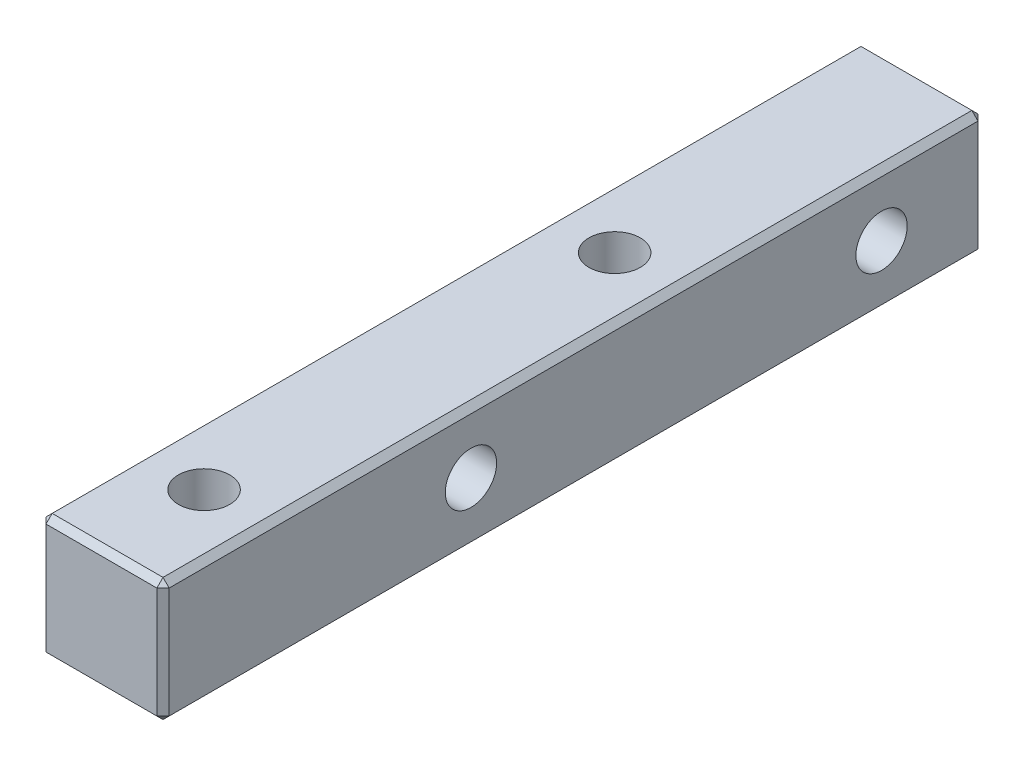
ISO-10303-21;
HEADER;
FILE_DESCRIPTION(('STEP AP214'),'2;1');
FILE_NAME('part.step','',(''),(''),'','','');
FILE_SCHEMA(('AUTOMOTIVE_DESIGN { 1 0 10303 214 1 1 1 1 }'));
ENDSEC;
DATA;
#1=APPLICATION_CONTEXT('core data for automotive mechanical design processes');
#2=APPLICATION_PROTOCOL_DEFINITION('international standard','automotive_design',2000,#1);
#3=PRODUCT_CONTEXT('',#1,'mechanical');
#4=PRODUCT('Part','Part','',(#3));
#5=PRODUCT_RELATED_PRODUCT_CATEGORY('part','',(#4));
#6=PRODUCT_DEFINITION_FORMATION('','',#4);
#7=PRODUCT_DEFINITION_CONTEXT('part definition',#1,'design');
#8=PRODUCT_DEFINITION('design','',#6,#7);
#9=PRODUCT_DEFINITION_SHAPE('','',#8);
#10=(LENGTH_UNIT() NAMED_UNIT(*) SI_UNIT(.MILLI.,.METRE.));
#11=(NAMED_UNIT(*) PLANE_ANGLE_UNIT() SI_UNIT($,.RADIAN.));
#12=(NAMED_UNIT(*) SI_UNIT($,.STERADIAN.) SOLID_ANGLE_UNIT());
#13=UNCERTAINTY_MEASURE_WITH_UNIT(LENGTH_MEASURE(1.E-05),#10,'distance_accuracy_value','');
#14=(GEOMETRIC_REPRESENTATION_CONTEXT(3) GLOBAL_UNCERTAINTY_ASSIGNED_CONTEXT((#13)) GLOBAL_UNIT_ASSIGNED_CONTEXT((#10,
#11,#12)) REPRESENTATION_CONTEXT('',''));
#15=CARTESIAN_POINT('',(0.,0.,0.));
#16=DIRECTION('',(0.,0.,1.));
#17=DIRECTION('',(1.,0.,0.));
#18=AXIS2_PLACEMENT_3D('',#15,#16,#17);
#19=CARTESIAN_POINT('',(-3.,-3.,20.));
#20=DIRECTION('',(1.,0.,0.));
#21=DIRECTION('',(0.,0.,-1.));
#22=AXIS2_PLACEMENT_3D('',#19,#20,#21);
#23=PLANE('',#22);
#24=DIRECTION('',(0.,-1.,0.));
#25=VECTOR('',#24,1.);
#26=CARTESIAN_POINT('',(-3.,-3.,-19.7));
#27=LINE('',#26,#25);
#28=CARTESIAN_POINT('',(-3.,2.7,-19.7));
#29=VERTEX_POINT('',#28);
#30=CARTESIAN_POINT('',(-3.,-2.7,-19.7));
#31=VERTEX_POINT('',#30);
#32=EDGE_CURVE('E192',#29,#31,#27,.T.);
#33=ORIENTED_EDGE('',*,*,#32,.T.);
#34=DIRECTION('',(0.,0.,1.));
#35=VECTOR('',#34,1.);
#36=CARTESIAN_POINT('',(-3.,-2.7,20.));
#37=LINE('',#36,#35);
#38=CARTESIAN_POINT('',(-3.,-2.7,19.7));
#39=VERTEX_POINT('',#38);
#40=EDGE_CURVE('E194',#31,#39,#37,.T.);
#41=ORIENTED_EDGE('',*,*,#40,.T.);
#42=DIRECTION('',(0.,1.,0.));
#43=VECTOR('',#42,1.);
#44=CARTESIAN_POINT('',(-3.,-3.,19.7));
#45=LINE('',#44,#43);
#46=CARTESIAN_POINT('',(-3.,2.7,19.7));
#47=VERTEX_POINT('',#46);
#48=EDGE_CURVE('E190',#39,#47,#45,.T.);
#49=ORIENTED_EDGE('',*,*,#48,.T.);
#50=DIRECTION('',(0.,0.,-1.));
#51=VECTOR('',#50,1.);
#52=CARTESIAN_POINT('',(-3.,2.7,20.));
#53=LINE('',#52,#51);
#54=EDGE_CURVE('E188',#47,#29,#53,.T.);
#55=ORIENTED_EDGE('',*,*,#54,.T.);
#56=EDGE_LOOP('',(#33,#41,#49,#55));
#57=FACE_BOUND('',#56,.T.);
#58=CARTESIAN_POINT('',(-3.,0.,-15.));
#59=DIRECTION('',(-1.,0.,0.));
#60=DIRECTION('',(0.,0.,1.));
#61=AXIS2_PLACEMENT_3D('',#58,#59,#60);
#62=CIRCLE('',#61,1.24999999999999);
#63=CARTESIAN_POINT('',(-3.,0.,-13.75));
#64=VERTEX_POINT('',#63);
#65=EDGE_CURVE('E285',#64,#64,#62,.T.);
#66=ORIENTED_EDGE('',*,*,#65,.F.);
#67=EDGE_LOOP('',(#66));
#68=FACE_BOUND('',#67,.T.);
#69=CARTESIAN_POINT('',(-3.,0.,5.));
#70=DIRECTION('',(-1.,0.,0.));
#71=DIRECTION('',(0.,0.,1.));
#72=AXIS2_PLACEMENT_3D('',#69,#70,#71);
#73=CIRCLE('',#72,1.24999999999999);
#74=CARTESIAN_POINT('',(-3.,0.,6.24999999999999));
#75=VERTEX_POINT('',#74);
#76=EDGE_CURVE('E291',#75,#75,#73,.T.);
#77=ORIENTED_EDGE('',*,*,#76,.F.);
#78=EDGE_LOOP('',(#77));
#79=FACE_BOUND('',#78,.T.);
#80=ADVANCED_FACE('F42',(#57,#68,#79),#23,.F.);
#81=CARTESIAN_POINT('',(3.,-3.,20.));
#82=DIRECTION('',(-1.,0.,0.));
#83=DIRECTION('',(0.,-1.,0.));
#84=AXIS2_PLACEMENT_3D('',#81,#82,#83);
#85=PLANE('',#84);
#86=DIRECTION('',(0.,0.,1.));
#87=VECTOR('',#86,1.);
#88=CARTESIAN_POINT('',(3.,2.7,20.));
#89=LINE('',#88,#87);
#90=CARTESIAN_POINT('',(3.,2.7,-19.7));
#91=VERTEX_POINT('',#90);
#92=CARTESIAN_POINT('',(3.,2.7,19.7));
#93=VERTEX_POINT('',#92);
#94=EDGE_CURVE('E206',#91,#93,#89,.T.);
#95=ORIENTED_EDGE('',*,*,#94,.T.);
#96=DIRECTION('',(0.,-1.,0.));
#97=VECTOR('',#96,1.);
#98=CARTESIAN_POINT('',(3.,-3.,19.7));
#99=LINE('',#98,#97);
#100=CARTESIAN_POINT('',(3.,-2.7,19.7));
#101=VERTEX_POINT('',#100);
#102=EDGE_CURVE('E11',#93,#101,#99,.T.);
#103=ORIENTED_EDGE('',*,*,#102,.T.);
#104=DIRECTION('',(0.,0.,-1.));
#105=VECTOR('',#104,1.);
#106=CARTESIAN_POINT('',(3.,-2.7,20.));
#107=LINE('',#106,#105);
#108=CARTESIAN_POINT('',(3.,-2.7,-19.7));
#109=VERTEX_POINT('',#108);
#110=EDGE_CURVE('E52',#101,#109,#107,.T.);
#111=ORIENTED_EDGE('',*,*,#110,.T.);
#112=DIRECTION('',(0.,1.,0.));
#113=VECTOR('',#112,1.);
#114=CARTESIAN_POINT('',(3.,3.,-19.7));
#115=LINE('',#114,#113);
#116=EDGE_CURVE('E208',#109,#91,#115,.T.);
#117=ORIENTED_EDGE('',*,*,#116,.T.);
#118=EDGE_LOOP('',(#95,#103,#111,#117));
#119=FACE_BOUND('',#118,.T.);
#120=CARTESIAN_POINT('',(3.,0.,-15.));
#121=DIRECTION('',(-1.,0.,0.));
#122=DIRECTION('',(0.,-1.,0.));
#123=AXIS2_PLACEMENT_3D('',#120,#121,#122);
#124=CIRCLE('',#123,1.24999999999999);
#125=CARTESIAN_POINT('',(3.,-1.24999999999999,-15.));
#126=VERTEX_POINT('',#125);
#127=EDGE_CURVE('E288',#126,#126,#124,.T.);
#128=ORIENTED_EDGE('',*,*,#127,.T.);
#129=EDGE_LOOP('',(#128));
#130=FACE_BOUND('',#129,.T.);
#131=CARTESIAN_POINT('',(3.,0.,5.));
#132=DIRECTION('',(-1.,0.,0.));
#133=DIRECTION('',(0.,-1.,0.));
#134=AXIS2_PLACEMENT_3D('',#131,#132,#133);
#135=CIRCLE('',#134,1.24999999999999);
#136=CARTESIAN_POINT('',(3.,-1.24999999999999,5.));
#137=VERTEX_POINT('',#136);
#138=EDGE_CURVE('E161',#137,#137,#135,.T.);
#139=ORIENTED_EDGE('',*,*,#138,.T.);
#140=EDGE_LOOP('',(#139));
#141=FACE_BOUND('',#140,.T.);
#142=ADVANCED_FACE('F363',(#119,#130,#141),#85,.F.);
#143=CARTESIAN_POINT('',(-3.,3.,20.));
#144=DIRECTION('',(0.,-1.,0.));
#145=DIRECTION('',(1.,0.,0.));
#146=AXIS2_PLACEMENT_3D('',#143,#144,#145);
#147=PLANE('',#146);
#148=DIRECTION('',(0.,0.,-1.));
#149=VECTOR('',#148,1.);
#150=CARTESIAN_POINT('',(2.7,3.,20.));
#151=LINE('',#150,#149);
#152=CARTESIAN_POINT('',(2.7,3.,19.7));
#153=VERTEX_POINT('',#152);
#154=CARTESIAN_POINT('',(2.7,3.,-19.7));
#155=VERTEX_POINT('',#154);
#156=EDGE_CURVE('E166',#153,#155,#151,.T.);
#157=ORIENTED_EDGE('',*,*,#156,.T.);
#158=DIRECTION('',(-1.,0.,0.));
#159=VECTOR('',#158,1.);
#160=CARTESIAN_POINT('',(-3.,3.,-19.7));
#161=LINE('',#160,#159);
#162=CARTESIAN_POINT('',(-2.7,3.,-19.7));
#163=VERTEX_POINT('',#162);
#164=EDGE_CURVE('E136',#155,#163,#161,.T.);
#165=ORIENTED_EDGE('',*,*,#164,.T.);
#166=DIRECTION('',(0.,0.,1.));
#167=VECTOR('',#166,1.);
#168=CARTESIAN_POINT('',(-2.7,3.,20.));
#169=LINE('',#168,#167);
#170=CARTESIAN_POINT('',(-2.7,3.,19.7));
#171=VERTEX_POINT('',#170);
#172=EDGE_CURVE('E154',#163,#171,#169,.T.);
#173=ORIENTED_EDGE('',*,*,#172,.T.);
#174=DIRECTION('',(1.,0.,0.));
#175=VECTOR('',#174,1.);
#176=CARTESIAN_POINT('',(-3.,3.,19.7));
#177=LINE('',#176,#175);
#178=EDGE_CURVE('E160',#171,#153,#177,.T.);
#179=ORIENTED_EDGE('',*,*,#178,.T.);
#180=EDGE_LOOP('',(#157,#165,#173,#179));
#181=FACE_BOUND('',#180,.T.);
#182=CARTESIAN_POINT('',(0.,3.,-5.));
#183=DIRECTION('',(0.,1.,0.));
#184=DIRECTION('',(0.,0.,1.));
#185=AXIS2_PLACEMENT_3D('',#182,#183,#184);
#186=CIRCLE('',#185,1.24999999999999);
#187=CARTESIAN_POINT('',(0.,3.,-3.75000000000001));
#188=VERTEX_POINT('',#187);
#189=EDGE_CURVE('E267',#188,#188,#186,.T.);
#190=ORIENTED_EDGE('',*,*,#189,.F.);
#191=EDGE_LOOP('',(#190));
#192=FACE_BOUND('',#191,.T.);
#193=CARTESIAN_POINT('',(0.,3.,15.));
#194=DIRECTION('',(0.,1.,0.));
#195=DIRECTION('',(0.,0.,1.));
#196=AXIS2_PLACEMENT_3D('',#193,#194,#195);
#197=CIRCLE('',#196,1.24999999999999);
#198=CARTESIAN_POINT('',(0.,3.,16.25));
#199=VERTEX_POINT('',#198);
#200=EDGE_CURVE('E277',#199,#199,#197,.T.);
#201=ORIENTED_EDGE('',*,*,#200,.F.);
#202=EDGE_LOOP('',(#201));
#203=FACE_BOUND('',#202,.T.);
#204=ADVANCED_FACE('F163',(#181,#192,#203),#147,.F.);
#205=CARTESIAN_POINT('',(-3.,-3.,20.));
#206=DIRECTION('',(0.,1.,0.));
#207=DIRECTION('',(0.,0.,1.));
#208=AXIS2_PLACEMENT_3D('',#205,#206,#207);
#209=PLANE('',#208);
#210=DIRECTION('',(0.,0.,1.));
#211=VECTOR('',#210,1.);
#212=CARTESIAN_POINT('',(2.7,-3.,20.));
#213=LINE('',#212,#211);
#214=CARTESIAN_POINT('',(2.7,-3.,-19.7));
#215=VERTEX_POINT('',#214);
#216=CARTESIAN_POINT('',(2.7,-3.,19.7));
#217=VERTEX_POINT('',#216);
#218=EDGE_CURVE('E181',#215,#217,#213,.T.);
#219=ORIENTED_EDGE('',*,*,#218,.T.);
#220=DIRECTION('',(-1.,0.,0.));
#221=VECTOR('',#220,1.);
#222=CARTESIAN_POINT('',(-3.,-3.,19.7));
#223=LINE('',#222,#221);
#224=CARTESIAN_POINT('',(-2.7,-3.,19.7));
#225=VERTEX_POINT('',#224);
#226=EDGE_CURVE('E186',#217,#225,#223,.T.);
#227=ORIENTED_EDGE('',*,*,#226,.T.);
#228=DIRECTION('',(0.,0.,-1.));
#229=VECTOR('',#228,1.);
#230=CARTESIAN_POINT('',(-2.7,-3.,20.));
#231=LINE('',#230,#229);
#232=CARTESIAN_POINT('',(-2.7,-3.,-19.7));
#233=VERTEX_POINT('',#232);
#234=EDGE_CURVE('E183',#225,#233,#231,.T.);
#235=ORIENTED_EDGE('',*,*,#234,.T.);
#236=DIRECTION('',(1.,0.,0.));
#237=VECTOR('',#236,1.);
#238=CARTESIAN_POINT('',(3.,-3.,-19.7));
#239=LINE('',#238,#237);
#240=EDGE_CURVE('E179',#233,#215,#239,.T.);
#241=ORIENTED_EDGE('',*,*,#240,.T.);
#242=EDGE_LOOP('',(#219,#227,#235,#241));
#243=FACE_BOUND('',#242,.T.);
#244=CARTESIAN_POINT('',(0.,-3.,-5.));
#245=DIRECTION('',(0.,1.,0.));
#246=DIRECTION('',(0.,0.,1.));
#247=AXIS2_PLACEMENT_3D('',#244,#245,#246);
#248=CIRCLE('',#247,1.24999999999999);
#249=CARTESIAN_POINT('',(0.,-3.,-3.75000000000001));
#250=VERTEX_POINT('',#249);
#251=EDGE_CURVE('E272',#250,#250,#248,.T.);
#252=ORIENTED_EDGE('',*,*,#251,.T.);
#253=EDGE_LOOP('',(#252));
#254=FACE_BOUND('',#253,.T.);
#255=CARTESIAN_POINT('',(0.,-3.,15.));
#256=DIRECTION('',(0.,1.,0.));
#257=DIRECTION('',(0.,0.,1.));
#258=AXIS2_PLACEMENT_3D('',#255,#256,#257);
#259=CIRCLE('',#258,1.24999999999999);
#260=CARTESIAN_POINT('',(0.,-3.,16.25));
#261=VERTEX_POINT('',#260);
#262=EDGE_CURVE('E282',#261,#261,#259,.T.);
#263=ORIENTED_EDGE('',*,*,#262,.T.);
#264=EDGE_LOOP('',(#263));
#265=FACE_BOUND('',#264,.T.);
#266=ADVANCED_FACE('F340',(#243,#254,#265),#209,.F.);
#267=CARTESIAN_POINT('',(0.,0.,20.));
#268=DIRECTION('',(0.,0.,-1.));
#269=DIRECTION('',(-1.,0.,0.));
#270=AXIS2_PLACEMENT_3D('',#267,#268,#269);
#271=PLANE('',#270);
#272=DIRECTION('',(1.,0.,0.));
#273=VECTOR('',#272,1.);
#274=CARTESIAN_POINT('',(0.,-2.7,20.));
#275=LINE('',#274,#273);
#276=CARTESIAN_POINT('',(-2.7,-2.7,20.));
#277=VERTEX_POINT('',#276);
#278=CARTESIAN_POINT('',(2.7,-2.7,20.));
#279=VERTEX_POINT('',#278);
#280=EDGE_CURVE('E201',#277,#279,#275,.T.);
#281=ORIENTED_EDGE('',*,*,#280,.T.);
#282=DIRECTION('',(0.,1.,0.));
#283=VECTOR('',#282,1.);
#284=CARTESIAN_POINT('',(2.7,0.,20.));
#285=LINE('',#284,#283);
#286=CARTESIAN_POINT('',(2.7,2.7,20.));
#287=VERTEX_POINT('',#286);
#288=EDGE_CURVE('E203',#279,#287,#285,.T.);
#289=ORIENTED_EDGE('',*,*,#288,.T.);
#290=DIRECTION('',(-1.,0.,0.));
#291=VECTOR('',#290,1.);
#292=CARTESIAN_POINT('',(0.,2.7,20.));
#293=LINE('',#292,#291);
#294=CARTESIAN_POINT('',(-2.7,2.7,20.));
#295=VERTEX_POINT('',#294);
#296=EDGE_CURVE('E199',#287,#295,#293,.T.);
#297=ORIENTED_EDGE('',*,*,#296,.T.);
#298=DIRECTION('',(0.,-1.,0.));
#299=VECTOR('',#298,1.);
#300=CARTESIAN_POINT('',(-2.7,0.,20.));
#301=LINE('',#300,#299);
#302=EDGE_CURVE('E197',#295,#277,#301,.T.);
#303=ORIENTED_EDGE('',*,*,#302,.T.);
#304=EDGE_LOOP('',(#281,#289,#297,#303));
#305=FACE_BOUND('',#304,.T.);
#306=ADVANCED_FACE('F466',(#305),#271,.F.);
#307=CARTESIAN_POINT('',(0.,0.,-20.));
#308=DIRECTION('',(0.,0.,-1.));
#309=DIRECTION('',(-1.,0.,0.));
#310=AXIS2_PLACEMENT_3D('',#307,#308,#309);
#311=PLANE('',#310);
#312=DIRECTION('',(-1.,0.,0.));
#313=VECTOR('',#312,1.);
#314=CARTESIAN_POINT('',(-3.,-2.7,-20.));
#315=LINE('',#314,#313);
#316=CARTESIAN_POINT('',(2.7,-2.7,-20.));
#317=VERTEX_POINT('',#316);
#318=CARTESIAN_POINT('',(-2.7,-2.7,-20.));
#319=VERTEX_POINT('',#318);
#320=EDGE_CURVE('E170',#317,#319,#315,.T.);
#321=ORIENTED_EDGE('',*,*,#320,.T.);
#322=DIRECTION('',(0.,1.,0.));
#323=VECTOR('',#322,1.);
#324=CARTESIAN_POINT('',(-2.7,3.,-20.));
#325=LINE('',#324,#323);
#326=CARTESIAN_POINT('',(-2.7,2.7,-20.));
#327=VERTEX_POINT('',#326);
#328=EDGE_CURVE('E177',#319,#327,#325,.T.);
#329=ORIENTED_EDGE('',*,*,#328,.T.);
#330=DIRECTION('',(1.,0.,0.));
#331=VECTOR('',#330,1.);
#332=CARTESIAN_POINT('',(3.,2.7,-20.));
#333=LINE('',#332,#331);
#334=CARTESIAN_POINT('',(2.7,2.7,-20.));
#335=VERTEX_POINT('',#334);
#336=EDGE_CURVE('E138',#327,#335,#333,.T.);
#337=ORIENTED_EDGE('',*,*,#336,.T.);
#338=DIRECTION('',(0.,-1.,0.));
#339=VECTOR('',#338,1.);
#340=CARTESIAN_POINT('',(2.7,-3.,-20.));
#341=LINE('',#340,#339);
#342=EDGE_CURVE('E168',#335,#317,#341,.T.);
#343=ORIENTED_EDGE('',*,*,#342,.T.);
#344=EDGE_LOOP('',(#321,#329,#337,#343));
#345=FACE_BOUND('',#344,.T.);
#346=ADVANCED_FACE('F318',(#345),#311,.T.);
#347=CARTESIAN_POINT('',(-3.,0.,5.));
#348=DIRECTION('',(-1.,0.,0.));
#349=DIRECTION('',(0.,0.,1.));
#350=AXIS2_PLACEMENT_3D('',#347,#348,#349);
#351=CYLINDRICAL_SURFACE('',#350,1.24999999999999);
#352=ORIENTED_EDGE('',*,*,#138,.F.);
#353=EDGE_LOOP('',(#352));
#354=FACE_BOUND('',#353,.T.);
#355=ORIENTED_EDGE('',*,*,#76,.T.);
#356=EDGE_LOOP('',(#355));
#357=FACE_BOUND('',#356,.T.);
#358=ADVANCED_FACE('F473',(#354,#357),#351,.F.);
#359=CARTESIAN_POINT('',(-3.,0.,-15.));
#360=DIRECTION('',(-1.,0.,0.));
#361=DIRECTION('',(0.,0.,1.));
#362=AXIS2_PLACEMENT_3D('',#359,#360,#361);
#363=CYLINDRICAL_SURFACE('',#362,1.24999999999999);
#364=ORIENTED_EDGE('',*,*,#127,.F.);
#365=EDGE_LOOP('',(#364));
#366=FACE_BOUND('',#365,.T.);
#367=ORIENTED_EDGE('',*,*,#65,.T.);
#368=EDGE_LOOP('',(#367));
#369=FACE_BOUND('',#368,.T.);
#370=ADVANCED_FACE('F477',(#366,#369),#363,.F.);
#371=CARTESIAN_POINT('',(0.,3.,15.));
#372=DIRECTION('',(0.,1.,0.));
#373=DIRECTION('',(0.,0.,1.));
#374=AXIS2_PLACEMENT_3D('',#371,#372,#373);
#375=CYLINDRICAL_SURFACE('',#374,1.24999999999999);
#376=ORIENTED_EDGE('',*,*,#262,.F.);
#377=EDGE_LOOP('',(#376));
#378=FACE_BOUND('',#377,.T.);
#379=ORIENTED_EDGE('',*,*,#200,.T.);
#380=EDGE_LOOP('',(#379));
#381=FACE_BOUND('',#380,.T.);
#382=ADVANCED_FACE('F481',(#378,#381),#375,.F.);
#383=CARTESIAN_POINT('',(0.,3.,-5.));
#384=DIRECTION('',(0.,1.,0.));
#385=DIRECTION('',(0.,0.,1.));
#386=AXIS2_PLACEMENT_3D('',#383,#384,#385);
#387=CYLINDRICAL_SURFACE('',#386,1.24999999999999);
#388=ORIENTED_EDGE('',*,*,#251,.F.);
#389=EDGE_LOOP('',(#388));
#390=FACE_BOUND('',#389,.T.);
#391=ORIENTED_EDGE('',*,*,#189,.T.);
#392=EDGE_LOOP('',(#391));
#393=FACE_BOUND('',#392,.T.);
#394=ADVANCED_FACE('F461',(#390,#393),#387,.F.);
#395=CARTESIAN_POINT('',(0.,-2.7,20.));
#396=DIRECTION('',(0.,0.707106781186547,-0.707106781186547));
#397=DIRECTION('',(1.,0.,0.));
#398=AXIS2_PLACEMENT_3D('',#395,#396,#397);
#399=PLANE('',#398);
#400=DIRECTION('',(0.,0.707106781186547,0.707106781186547));
#401=VECTOR('',#400,1.);
#402=CARTESIAN_POINT('',(2.7,-2.85,19.85));
#403=LINE('',#402,#401);
#404=EDGE_CURVE('E47',#279,#217,#403,.F.);
#405=ORIENTED_EDGE('',*,*,#404,.F.);
#406=ORIENTED_EDGE('',*,*,#280,.F.);
#407=DIRECTION('',(0.,-0.707106781186547,-0.707106781186547));
#408=VECTOR('',#407,1.);
#409=CARTESIAN_POINT('',(-2.7,-2.85,19.85));
#410=LINE('',#409,#408);
#411=EDGE_CURVE('E260',#225,#277,#410,.F.);
#412=ORIENTED_EDGE('',*,*,#411,.F.);
#413=ORIENTED_EDGE('',*,*,#226,.F.);
#414=EDGE_LOOP('',(#405,#406,#412,#413));
#415=FACE_BOUND('',#414,.T.);
#416=ADVANCED_FACE('F45',(#415),#399,.F.);
#417=CARTESIAN_POINT('',(3.,-2.7,19.7));
#418=DIRECTION('',(0.577350269189626,-0.577350269189626,0.577350269189626));
#419=DIRECTION('',(0.707106781186547,0.,-0.707106781186547));
#420=AXIS2_PLACEMENT_3D('',#417,#418,#419);
#421=PLANE('',#420);
#422=DIRECTION('',(0.707106781186548,0.,-0.707106781186548));
#423=VECTOR('',#422,1.);
#424=CARTESIAN_POINT('',(3.,-2.7,19.7));
#425=LINE('',#424,#423);
#426=EDGE_CURVE('E256',#279,#101,#425,.T.);
#427=ORIENTED_EDGE('',*,*,#426,.F.);
#428=ORIENTED_EDGE('',*,*,#404,.T.);
#429=DIRECTION('',(-0.707106781186547,-0.707106781186547,0.));
#430=VECTOR('',#429,1.);
#431=CARTESIAN_POINT('',(3.,-2.7,19.7));
#432=LINE('',#431,#430);
#433=EDGE_CURVE('E259',#101,#217,#432,.T.);
#434=ORIENTED_EDGE('',*,*,#433,.F.);
#435=EDGE_LOOP('',(#427,#428,#434));
#436=FACE_BOUND('',#435,.T.);
#437=ADVANCED_FACE('F453',(#436),#421,.T.);
#438=CARTESIAN_POINT('',(-3.,-2.7,19.7));
#439=DIRECTION('',(-0.577350269189626,-0.577350269189626,0.577350269189626));
#440=DIRECTION('',(0.707106781186547,0.,0.707106781186547));
#441=AXIS2_PLACEMENT_3D('',#438,#439,#440);
#442=PLANE('',#441);
#443=DIRECTION('',(-0.707106781186547,0.707106781186547,0.));
#444=VECTOR('',#443,1.);
#445=CARTESIAN_POINT('',(-3.,-2.7,19.7));
#446=LINE('',#445,#444);
#447=EDGE_CURVE('E250',#225,#39,#446,.T.);
#448=ORIENTED_EDGE('',*,*,#447,.F.);
#449=ORIENTED_EDGE('',*,*,#411,.T.);
#450=DIRECTION('',(0.707106781186547,0.,0.707106781186547));
#451=VECTOR('',#450,1.);
#452=CARTESIAN_POINT('',(-3.,-2.7,19.7));
#453=LINE('',#452,#451);
#454=EDGE_CURVE('E253',#39,#277,#453,.T.);
#455=ORIENTED_EDGE('',*,*,#454,.F.);
#456=EDGE_LOOP('',(#448,#449,#455));
#457=FACE_BOUND('',#456,.T.);
#458=ADVANCED_FACE('F345',(#457),#442,.T.);
#459=CARTESIAN_POINT('',(3.,-2.7,20.));
#460=DIRECTION('',(-0.707106781186547,0.707106781186547,0.));
#461=DIRECTION('',(0.,0.,-1.));
#462=AXIS2_PLACEMENT_3D('',#459,#460,#461);
#463=PLANE('',#462);
#464=ORIENTED_EDGE('',*,*,#433,.T.);
#465=ORIENTED_EDGE('',*,*,#218,.F.);
#466=DIRECTION('',(0.707106781186548,0.707106781186548,0.));
#467=VECTOR('',#466,1.);
#468=CARTESIAN_POINT('',(3.,-2.7,-19.7));
#469=LINE('',#468,#467);
#470=EDGE_CURVE('E244',#109,#215,#469,.F.);
#471=ORIENTED_EDGE('',*,*,#470,.F.);
#472=ORIENTED_EDGE('',*,*,#110,.F.);
#473=EDGE_LOOP('',(#464,#465,#471,#472));
#474=FACE_BOUND('',#473,.T.);
#475=ADVANCED_FACE('F446',(#474),#463,.F.);
#476=CARTESIAN_POINT('',(2.7,0.,20.));
#477=DIRECTION('',(-0.707106781186547,0.,-0.707106781186547));
#478=DIRECTION('',(0.,1.,0.));
#479=AXIS2_PLACEMENT_3D('',#476,#477,#478);
#480=PLANE('',#479);
#481=ORIENTED_EDGE('',*,*,#426,.T.);
#482=ORIENTED_EDGE('',*,*,#102,.F.);
#483=DIRECTION('',(-0.707106781186547,0.,0.707106781186547));
#484=VECTOR('',#483,1.);
#485=CARTESIAN_POINT('',(2.7,2.7,20.));
#486=LINE('',#485,#484);
#487=EDGE_CURVE('E241',#287,#93,#486,.F.);
#488=ORIENTED_EDGE('',*,*,#487,.F.);
#489=ORIENTED_EDGE('',*,*,#288,.F.);
#490=EDGE_LOOP('',(#481,#482,#488,#489));
#491=FACE_BOUND('',#490,.T.);
#492=ADVANCED_FACE('F441',(#491),#480,.F.);
#493=CARTESIAN_POINT('',(0.,2.7,20.));
#494=DIRECTION('',(0.,-0.707106781186547,-0.707106781186547));
#495=DIRECTION('',(-1.,0.,0.));
#496=AXIS2_PLACEMENT_3D('',#493,#494,#495);
#497=PLANE('',#496);
#498=DIRECTION('',(0.,-0.707106781186548,0.707106781186548));
#499=VECTOR('',#498,1.);
#500=CARTESIAN_POINT('',(-2.7,2.7,20.));
#501=LINE('',#500,#499);
#502=EDGE_CURVE('E236',#295,#171,#501,.F.);
#503=ORIENTED_EDGE('',*,*,#502,.F.);
#504=ORIENTED_EDGE('',*,*,#296,.F.);
#505=DIRECTION('',(0.,0.707106781186547,-0.707106781186547));
#506=VECTOR('',#505,1.);
#507=CARTESIAN_POINT('',(2.7,2.7,20.));
#508=LINE('',#507,#506);
#509=EDGE_CURVE('E239',#153,#287,#508,.F.);
#510=ORIENTED_EDGE('',*,*,#509,.F.);
#511=ORIENTED_EDGE('',*,*,#178,.F.);
#512=EDGE_LOOP('',(#503,#504,#510,#511));
#513=FACE_BOUND('',#512,.T.);
#514=ADVANCED_FACE('F300',(#513),#497,.F.);
#515=CARTESIAN_POINT('',(-2.7,0.,20.));
#516=DIRECTION('',(0.707106781186547,0.,-0.707106781186547));
#517=DIRECTION('',(0.,-1.,0.));
#518=AXIS2_PLACEMENT_3D('',#515,#516,#517);
#519=PLANE('',#518);
#520=ORIENTED_EDGE('',*,*,#454,.T.);
#521=ORIENTED_EDGE('',*,*,#302,.F.);
#522=DIRECTION('',(-0.707106781186547,0.,-0.707106781186547));
#523=VECTOR('',#522,1.);
#524=CARTESIAN_POINT('',(-2.7,2.7,20.));
#525=LINE('',#524,#523);
#526=EDGE_CURVE('E233',#47,#295,#525,.F.);
#527=ORIENTED_EDGE('',*,*,#526,.F.);
#528=ORIENTED_EDGE('',*,*,#48,.F.);
#529=EDGE_LOOP('',(#520,#521,#527,#528));
#530=FACE_BOUND('',#529,.T.);
#531=ADVANCED_FACE('F348',(#530),#519,.F.);
#532=CARTESIAN_POINT('',(-2.7,-3.,20.));
#533=DIRECTION('',(0.707106781186547,0.707106781186547,0.));
#534=DIRECTION('',(0.,0.,-1.));
#535=AXIS2_PLACEMENT_3D('',#532,#533,#534);
#536=PLANE('',#535);
#537=ORIENTED_EDGE('',*,*,#447,.T.);
#538=ORIENTED_EDGE('',*,*,#40,.F.);
#539=DIRECTION('',(0.707106781186548,-0.707106781186548,0.));
#540=VECTOR('',#539,1.);
#541=CARTESIAN_POINT('',(-2.7,-3.,-19.7));
#542=LINE('',#541,#540);
#543=EDGE_CURVE('E230',#233,#31,#542,.F.);
#544=ORIENTED_EDGE('',*,*,#543,.F.);
#545=ORIENTED_EDGE('',*,*,#234,.F.);
#546=EDGE_LOOP('',(#537,#538,#544,#545));
#547=FACE_BOUND('',#546,.T.);
#548=ADVANCED_FACE('F330',(#547),#536,.F.);
#549=CARTESIAN_POINT('',(-3.,-3.,-19.7));
#550=DIRECTION('',(0.,-0.707106781186552,-0.707106781186543));
#551=DIRECTION('',(-1.,0.,0.));
#552=AXIS2_PLACEMENT_3D('',#549,#550,#551);
#553=PLANE('',#552);
#554=DIRECTION('',(0.,0.707106781186543,-0.707106781186552));
#555=VECTOR('',#554,1.);
#556=CARTESIAN_POINT('',(2.7,-2.85,-19.85));
#557=LINE('',#556,#555);
#558=EDGE_CURVE('E247',#215,#317,#557,.T.);
#559=ORIENTED_EDGE('',*,*,#558,.F.);
#560=ORIENTED_EDGE('',*,*,#240,.F.);
#561=DIRECTION('',(0.,-0.707106781186543,0.707106781186552));
#562=VECTOR('',#561,1.);
#563=CARTESIAN_POINT('',(-2.7,-3.,-19.7));
#564=LINE('',#563,#562);
#565=EDGE_CURVE('E228',#319,#233,#564,.T.);
#566=ORIENTED_EDGE('',*,*,#565,.F.);
#567=ORIENTED_EDGE('',*,*,#320,.F.);
#568=EDGE_LOOP('',(#559,#560,#566,#567));
#569=FACE_BOUND('',#568,.T.);
#570=ADVANCED_FACE('F337',(#569),#553,.T.);
#571=CARTESIAN_POINT('',(3.,-2.7,-19.7));
#572=DIRECTION('',(0.577350269189628,-0.577350269189628,-0.577350269189621));
#573=DIRECTION('',(0.707106781186547,0.707106781186547,0.));
#574=AXIS2_PLACEMENT_3D('',#571,#572,#573);
#575=PLANE('',#574);
#576=ORIENTED_EDGE('',*,*,#470,.T.);
#577=ORIENTED_EDGE('',*,*,#558,.T.);
#578=DIRECTION('',(0.707106781186543,0.,0.707106781186552));
#579=VECTOR('',#578,1.);
#580=CARTESIAN_POINT('',(3.,-2.7,-19.7));
#581=LINE('',#580,#579);
#582=EDGE_CURVE('E225',#109,#317,#581,.F.);
#583=ORIENTED_EDGE('',*,*,#582,.F.);
#584=EDGE_LOOP('',(#576,#577,#583));
#585=FACE_BOUND('',#584,.T.);
#586=ADVANCED_FACE('F359',(#585),#575,.T.);
#587=CARTESIAN_POINT('',(2.7,2.7,20.));
#588=DIRECTION('',(0.577350269189626,0.577350269189626,0.577350269189626));
#589=DIRECTION('',(0.707106781186547,0.,-0.707106781186547));
#590=AXIS2_PLACEMENT_3D('',#587,#588,#589);
#591=PLANE('',#590);
#592=ORIENTED_EDGE('',*,*,#509,.T.);
#593=ORIENTED_EDGE('',*,*,#487,.T.);
#594=DIRECTION('',(0.707106781186547,-0.707106781186547,0.));
#595=VECTOR('',#594,1.);
#596=CARTESIAN_POINT('',(2.85,2.85,19.7));
#597=LINE('',#596,#595);
#598=EDGE_CURVE('E222',#153,#93,#597,.T.);
#599=ORIENTED_EDGE('',*,*,#598,.F.);
#600=EDGE_LOOP('',(#592,#593,#599));
#601=FACE_BOUND('',#600,.T.);
#602=ADVANCED_FACE('F303',(#601),#591,.T.);
#603=CARTESIAN_POINT('',(-2.7,2.7,20.));
#604=DIRECTION('',(-0.577350269189626,0.577350269189626,0.577350269189626));
#605=DIRECTION('',(0.707106781186547,0.,0.707106781186547));
#606=AXIS2_PLACEMENT_3D('',#603,#604,#605);
#607=PLANE('',#606);
#608=ORIENTED_EDGE('',*,*,#526,.T.);
#609=ORIENTED_EDGE('',*,*,#502,.T.);
#610=DIRECTION('',(0.707106781186547,0.707106781186547,0.));
#611=VECTOR('',#610,1.);
#612=CARTESIAN_POINT('',(-2.85,2.85,19.7));
#613=LINE('',#612,#611);
#614=EDGE_CURVE('E157',#47,#171,#613,.T.);
#615=ORIENTED_EDGE('',*,*,#614,.F.);
#616=EDGE_LOOP('',(#608,#609,#615));
#617=FACE_BOUND('',#616,.T.);
#618=ADVANCED_FACE('F351',(#617),#607,.T.);
#619=CARTESIAN_POINT('',(-2.7,-3.,-19.7));
#620=DIRECTION('',(-0.577350269189628,-0.577350269189628,-0.577350269189621));
#621=DIRECTION('',(0.707106781186547,-0.707106781186547,0.));
#622=AXIS2_PLACEMENT_3D('',#619,#620,#621);
#623=PLANE('',#622);
#624=ORIENTED_EDGE('',*,*,#565,.T.);
#625=ORIENTED_EDGE('',*,*,#543,.T.);
#626=DIRECTION('',(0.707106781186543,0.,-0.707106781186552));
#627=VECTOR('',#626,1.);
#628=CARTESIAN_POINT('',(-2.85,-2.7,-19.85));
#629=LINE('',#628,#627);
#630=EDGE_CURVE('E218',#319,#31,#629,.F.);
#631=ORIENTED_EDGE('',*,*,#630,.F.);
#632=EDGE_LOOP('',(#624,#625,#631));
#633=FACE_BOUND('',#632,.T.);
#634=ADVANCED_FACE('F334',(#633),#623,.T.);
#635=CARTESIAN_POINT('',(3.,-3.,-19.7));
#636=DIRECTION('',(0.707106781186552,0.,-0.707106781186543));
#637=DIRECTION('',(0.,-1.,0.));
#638=AXIS2_PLACEMENT_3D('',#635,#636,#637);
#639=PLANE('',#638);
#640=ORIENTED_EDGE('',*,*,#582,.T.);
#641=ORIENTED_EDGE('',*,*,#342,.F.);
#642=DIRECTION('',(-0.707106781186543,0.,-0.707106781186552));
#643=VECTOR('',#642,1.);
#644=CARTESIAN_POINT('',(2.7,2.7,-20.));
#645=LINE('',#644,#643);
#646=EDGE_CURVE('E215',#91,#335,#645,.T.);
#647=ORIENTED_EDGE('',*,*,#646,.F.);
#648=ORIENTED_EDGE('',*,*,#116,.F.);
#649=EDGE_LOOP('',(#640,#641,#647,#648));
#650=FACE_BOUND('',#649,.T.);
#651=ADVANCED_FACE('F314',(#650),#639,.T.);
#652=CARTESIAN_POINT('',(2.7,3.,20.));
#653=DIRECTION('',(-0.707106781186547,-0.707106781186547,0.));
#654=DIRECTION('',(0.,0.,-1.));
#655=AXIS2_PLACEMENT_3D('',#652,#653,#654);
#656=PLANE('',#655);
#657=ORIENTED_EDGE('',*,*,#598,.T.);
#658=ORIENTED_EDGE('',*,*,#94,.F.);
#659=DIRECTION('',(-0.707106781186548,0.707106781186548,0.));
#660=VECTOR('',#659,1.);
#661=CARTESIAN_POINT('',(2.85,2.85,-19.7));
#662=LINE('',#661,#660);
#663=EDGE_CURVE('E151',#155,#91,#662,.F.);
#664=ORIENTED_EDGE('',*,*,#663,.F.);
#665=ORIENTED_EDGE('',*,*,#156,.F.);
#666=EDGE_LOOP('',(#657,#658,#664,#665));
#667=FACE_BOUND('',#666,.T.);
#668=ADVANCED_FACE('F306',(#667),#656,.F.);
#669=CARTESIAN_POINT('',(-3.,2.7,20.));
#670=DIRECTION('',(0.707106781186547,-0.707106781186547,0.));
#671=DIRECTION('',(0.,0.,-1.));
#672=AXIS2_PLACEMENT_3D('',#669,#670,#671);
#673=PLANE('',#672);
#674=ORIENTED_EDGE('',*,*,#614,.T.);
#675=ORIENTED_EDGE('',*,*,#172,.F.);
#676=DIRECTION('',(-0.707106781186548,-0.707106781186548,0.));
#677=VECTOR('',#676,1.);
#678=CARTESIAN_POINT('',(-2.7,3.,-19.7));
#679=LINE('',#678,#677);
#680=EDGE_CURVE('E144',#29,#163,#679,.F.);
#681=ORIENTED_EDGE('',*,*,#680,.F.);
#682=ORIENTED_EDGE('',*,*,#54,.F.);
#683=EDGE_LOOP('',(#674,#675,#681,#682));
#684=FACE_BOUND('',#683,.T.);
#685=ADVANCED_FACE('F155',(#684),#673,.F.);
#686=CARTESIAN_POINT('',(-3.,-3.,-19.7));
#687=DIRECTION('',(-0.707106781186552,0.,-0.707106781186543));
#688=DIRECTION('',(0.,1.,0.));
#689=AXIS2_PLACEMENT_3D('',#686,#687,#688);
#690=PLANE('',#689);
#691=ORIENTED_EDGE('',*,*,#630,.T.);
#692=ORIENTED_EDGE('',*,*,#32,.F.);
#693=DIRECTION('',(-0.707106781186543,0.,0.707106781186552));
#694=VECTOR('',#693,1.);
#695=CARTESIAN_POINT('',(-2.85,2.7,-19.85));
#696=LINE('',#695,#694);
#697=EDGE_CURVE('E148',#327,#29,#696,.T.);
#698=ORIENTED_EDGE('',*,*,#697,.F.);
#699=ORIENTED_EDGE('',*,*,#328,.F.);
#700=EDGE_LOOP('',(#691,#692,#698,#699));
#701=FACE_BOUND('',#700,.T.);
#702=ADVANCED_FACE('F323',(#701),#690,.T.);
#703=CARTESIAN_POINT('',(2.7,2.7,-20.));
#704=DIRECTION('',(0.577350269189628,0.577350269189628,-0.577350269189621));
#705=DIRECTION('',(-0.707106781186547,0.707106781186547,0.));
#706=AXIS2_PLACEMENT_3D('',#703,#704,#705);
#707=PLANE('',#706);
#708=ORIENTED_EDGE('',*,*,#663,.T.);
#709=ORIENTED_EDGE('',*,*,#646,.T.);
#710=DIRECTION('',(0.,0.707106781186543,0.707106781186551));
#711=VECTOR('',#710,1.);
#712=CARTESIAN_POINT('',(2.7,2.7,-20.));
#713=LINE('',#712,#711);
#714=EDGE_CURVE('E141',#155,#335,#713,.F.);
#715=ORIENTED_EDGE('',*,*,#714,.F.);
#716=EDGE_LOOP('',(#708,#709,#715));
#717=FACE_BOUND('',#716,.T.);
#718=ADVANCED_FACE('F310',(#717),#707,.T.);
#719=CARTESIAN_POINT('',(-2.7,3.,-19.7));
#720=DIRECTION('',(-0.577350269189628,0.577350269189628,-0.577350269189621));
#721=DIRECTION('',(-0.707106781186547,-0.707106781186547,0.));
#722=AXIS2_PLACEMENT_3D('',#719,#720,#721);
#723=PLANE('',#722);
#724=ORIENTED_EDGE('',*,*,#697,.T.);
#725=ORIENTED_EDGE('',*,*,#680,.T.);
#726=DIRECTION('',(0.,-0.707106781186543,-0.707106781186552));
#727=VECTOR('',#726,1.);
#728=CARTESIAN_POINT('',(-2.7,3.,-19.7));
#729=LINE('',#728,#727);
#730=EDGE_CURVE('E132',#327,#163,#729,.F.);
#731=ORIENTED_EDGE('',*,*,#730,.F.);
#732=EDGE_LOOP('',(#724,#725,#731));
#733=FACE_BOUND('',#732,.T.);
#734=ADVANCED_FACE('F146',(#733),#723,.T.);
#735=CARTESIAN_POINT('',(-3.,3.,-19.7));
#736=DIRECTION('',(0.,0.707106781186552,-0.707106781186543));
#737=DIRECTION('',(1.,0.,0.));
#738=AXIS2_PLACEMENT_3D('',#735,#736,#737);
#739=PLANE('',#738);
#740=ORIENTED_EDGE('',*,*,#714,.T.);
#741=ORIENTED_EDGE('',*,*,#336,.F.);
#742=ORIENTED_EDGE('',*,*,#730,.T.);
#743=ORIENTED_EDGE('',*,*,#164,.F.);
#744=EDGE_LOOP('',(#740,#741,#742,#743));
#745=FACE_BOUND('',#744,.T.);
#746=ADVANCED_FACE('F134',(#745),#739,.T.);
#747=CLOSED_SHELL('',(#80,#142,#204,#266,#306,#346,#358,#370,#382,#394,#416,#437,#458,#475,#492,
#514,#531,#548,#570,#586,#602,#618,#634,#651,#668,#685,#702,#718,#734,#746));
#748=MANIFOLD_SOLID_BREP('B2',#747);
#749=ADVANCED_BREP_SHAPE_REPRESENTATION('',(#18,#748),#14);
#750=SHAPE_DEFINITION_REPRESENTATION(#9,#749);
ENDSEC;
END-ISO-10303-21;
